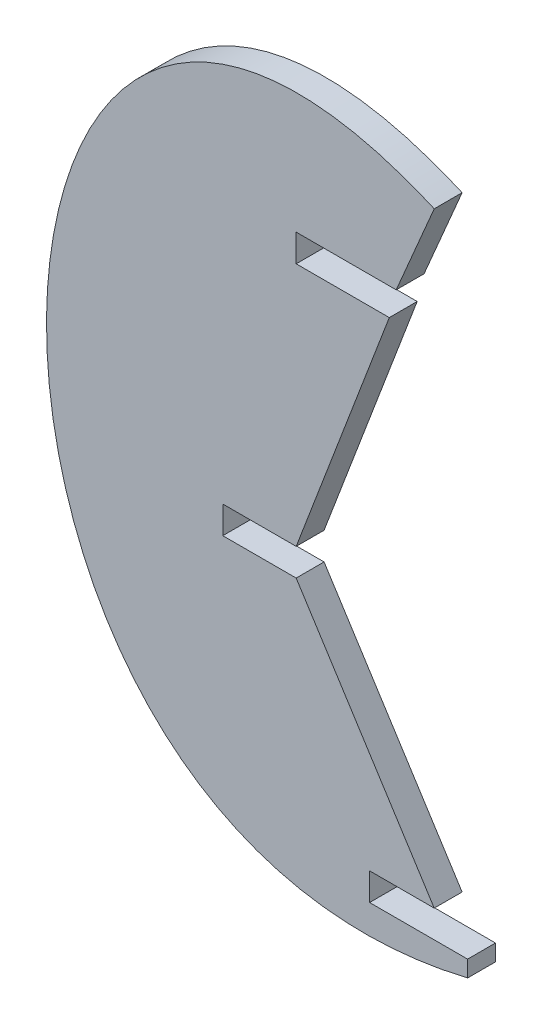
ISO-10303-21;
HEADER;
FILE_DESCRIPTION(('STEP AP214'),'2;1');
FILE_NAME('part.step','',(''),(''),'','','');
FILE_SCHEMA(('AUTOMOTIVE_DESIGN { 1 0 10303 214 1 1 1 1 }'));
ENDSEC;
DATA;
#1=APPLICATION_CONTEXT('core data for automotive mechanical design processes');
#2=APPLICATION_PROTOCOL_DEFINITION('international standard','automotive_design',2000,#1);
#3=PRODUCT_CONTEXT('',#1,'mechanical');
#4=PRODUCT('Part','Part','',(#3));
#5=PRODUCT_RELATED_PRODUCT_CATEGORY('part','',(#4));
#6=PRODUCT_DEFINITION_FORMATION('','',#4);
#7=PRODUCT_DEFINITION_CONTEXT('part definition',#1,'design');
#8=PRODUCT_DEFINITION('design','',#6,#7);
#9=PRODUCT_DEFINITION_SHAPE('','',#8);
#10=(LENGTH_UNIT() NAMED_UNIT(*) SI_UNIT(.MILLI.,.METRE.));
#11=(NAMED_UNIT(*) PLANE_ANGLE_UNIT() SI_UNIT($,.RADIAN.));
#12=(NAMED_UNIT(*) SI_UNIT($,.STERADIAN.) SOLID_ANGLE_UNIT());
#13=UNCERTAINTY_MEASURE_WITH_UNIT(LENGTH_MEASURE(1.E-05),#10,'distance_accuracy_value','');
#14=(GEOMETRIC_REPRESENTATION_CONTEXT(3) GLOBAL_UNCERTAINTY_ASSIGNED_CONTEXT((#13)) GLOBAL_UNIT_ASSIGNED_CONTEXT((#10,
#11,#12)) REPRESENTATION_CONTEXT('',''));
#15=CARTESIAN_POINT('',(0.,0.,0.));
#16=DIRECTION('',(0.,0.,1.));
#17=DIRECTION('',(1.,0.,0.));
#18=AXIS2_PLACEMENT_3D('',#15,#16,#17);
#19=CARTESIAN_POINT('',(-40.0225,105.61,5.7));
#20=DIRECTION('',(0.,1.,0.));
#21=DIRECTION('',(-1.,0.,0.));
#22=AXIS2_PLACEMENT_3D('',#19,#20,#21);
#23=PLANE('',#22);
#24=DIRECTION('',(1.,0.,0.));
#25=VECTOR('',#24,1.);
#26=CARTESIAN_POINT('',(-40.0225,105.61,0.));
#27=LINE('',#26,#25);
#28=CARTESIAN_POINT('',(-40.0225,105.61,0.));
#29=VERTEX_POINT('',#28);
#30=CARTESIAN_POINT('',(-20.9989229059,105.61,0.));
#31=VERTEX_POINT('',#30);
#32=EDGE_CURVE('E235',#29,#31,#27,.T.);
#33=ORIENTED_EDGE('',*,*,#32,.F.);
#34=DIRECTION('',(0.,0.,-1.));
#35=VECTOR('',#34,1.);
#36=CARTESIAN_POINT('',(-40.0225,105.61,5.7));
#37=LINE('',#36,#35);
#38=CARTESIAN_POINT('',(-40.0225,105.61,5.7));
#39=VERTEX_POINT('',#38);
#40=EDGE_CURVE('E12',#39,#29,#37,.T.);
#41=ORIENTED_EDGE('',*,*,#40,.F.);
#42=DIRECTION('',(1.,0.,0.));
#43=VECTOR('',#42,1.);
#44=CARTESIAN_POINT('',(-40.0225,105.61,5.7));
#45=LINE('',#44,#43);
#46=CARTESIAN_POINT('',(-20.9989229059,105.61,5.7));
#47=VERTEX_POINT('',#46);
#48=EDGE_CURVE('E227',#39,#47,#45,.T.);
#49=ORIENTED_EDGE('',*,*,#48,.T.);
#50=DIRECTION('',(0.,0.,-1.));
#51=VECTOR('',#50,1.);
#52=CARTESIAN_POINT('',(-20.9989229059,105.61,5.7));
#53=LINE('',#52,#51);
#54=EDGE_CURVE('E39',#47,#31,#53,.T.);
#55=ORIENTED_EDGE('',*,*,#54,.T.);
#56=EDGE_LOOP('',(#33,#41,#49,#55));
#57=FACE_BOUND('',#56,.T.);
#58=ADVANCED_FACE('F36',(#57),#23,.T.);
#59=CARTESIAN_POINT('',(-40.0225,111.22,5.7));
#60=DIRECTION('',(1.,0.,0.));
#61=DIRECTION('',(0.,0.,-1.));
#62=AXIS2_PLACEMENT_3D('',#59,#60,#61);
#63=PLANE('',#62);
#64=DIRECTION('',(0.,-1.,0.));
#65=VECTOR('',#64,1.);
#66=CARTESIAN_POINT('',(-40.0225,111.22,0.));
#67=LINE('',#66,#65);
#68=CARTESIAN_POINT('',(-40.0225,111.22,0.));
#69=VERTEX_POINT('',#68);
#70=EDGE_CURVE('E230',#69,#29,#67,.T.);
#71=ORIENTED_EDGE('',*,*,#70,.F.);
#72=DIRECTION('',(0.,0.,-1.));
#73=VECTOR('',#72,1.);
#74=CARTESIAN_POINT('',(-40.0225,111.22,5.7));
#75=LINE('',#74,#73);
#76=CARTESIAN_POINT('',(-40.0225,111.22,5.7));
#77=VERTEX_POINT('',#76);
#78=EDGE_CURVE('E45',#77,#69,#75,.T.);
#79=ORIENTED_EDGE('',*,*,#78,.F.);
#80=DIRECTION('',(0.,-1.,0.));
#81=VECTOR('',#80,1.);
#82=CARTESIAN_POINT('',(-40.0225,111.22,5.7));
#83=LINE('',#82,#81);
#84=EDGE_CURVE('E159',#77,#39,#83,.T.);
#85=ORIENTED_EDGE('',*,*,#84,.T.);
#86=ORIENTED_EDGE('',*,*,#40,.T.);
#87=EDGE_LOOP('',(#71,#79,#85,#86));
#88=FACE_BOUND('',#87,.T.);
#89=ADVANCED_FACE('F300',(#88),#63,.T.);
#90=CARTESIAN_POINT('',(-19.5846525168,111.22,5.7));
#91=DIRECTION('',(0.,-1.,0.));
#92=DIRECTION('',(0.,0.,-1.));
#93=AXIS2_PLACEMENT_3D('',#90,#91,#92);
#94=PLANE('',#93);
#95=DIRECTION('',(-1.,0.,0.));
#96=VECTOR('',#95,1.);
#97=CARTESIAN_POINT('',(-19.5846525168,111.22,0.));
#98=LINE('',#97,#96);
#99=CARTESIAN_POINT('',(-19.5846525168,111.22,0.));
#100=VERTEX_POINT('',#99);
#101=EDGE_CURVE('E146',#100,#69,#98,.T.);
#102=ORIENTED_EDGE('',*,*,#101,.F.);
#103=DIRECTION('',(0.,0.,-1.));
#104=VECTOR('',#103,1.);
#105=CARTESIAN_POINT('',(-19.5846525168,111.22,5.7));
#106=LINE('',#105,#104);
#107=CARTESIAN_POINT('',(-19.5846525168,111.22,5.7));
#108=VERTEX_POINT('',#107);
#109=EDGE_CURVE('E141',#108,#100,#106,.T.);
#110=ORIENTED_EDGE('',*,*,#109,.F.);
#111=DIRECTION('',(-1.,0.,0.));
#112=VECTOR('',#111,1.);
#113=CARTESIAN_POINT('',(-19.5846525168,111.22,5.7));
#114=LINE('',#113,#112);
#115=EDGE_CURVE('E144',#108,#77,#114,.T.);
#116=ORIENTED_EDGE('',*,*,#115,.T.);
#117=ORIENTED_EDGE('',*,*,#78,.T.);
#118=EDGE_LOOP('',(#102,#110,#116,#117));
#119=FACE_BOUND('',#118,.T.);
#120=ADVANCED_FACE('F143',(#119),#94,.T.);
#121=CARTESIAN_POINT('',(-11.8183247946,129.448781979,5.7));
#122=DIRECTION('',(0.919983637740173,-0.391956765843324,0.));
#123=DIRECTION('',(0.391956765843324,0.919983637740173,0.));
#124=AXIS2_PLACEMENT_3D('',#121,#122,#123);
#125=PLANE('',#124);
#126=DIRECTION('',(-0.391956765843324,-0.919983637740173,0.));
#127=VECTOR('',#126,1.);
#128=CARTESIAN_POINT('',(-11.8183247946,129.448781979,0.));
#129=LINE('',#128,#127);
#130=CARTESIAN_POINT('',(-11.8183247946,129.448781979,0.));
#131=VERTEX_POINT('',#130);
#132=EDGE_CURVE('E270',#131,#100,#129,.T.);
#133=ORIENTED_EDGE('',*,*,#132,.F.);
#134=DIRECTION('',(0.,0.,-1.));
#135=VECTOR('',#134,1.);
#136=CARTESIAN_POINT('',(-11.8183247946,129.448781979,5.7));
#137=LINE('',#136,#135);
#138=CARTESIAN_POINT('',(-11.8183247946,129.448781979,5.7));
#139=VERTEX_POINT('',#138);
#140=EDGE_CURVE('E151',#139,#131,#137,.T.);
#141=ORIENTED_EDGE('',*,*,#140,.F.);
#142=DIRECTION('',(-0.391956765843324,-0.919983637740173,0.));
#143=VECTOR('',#142,1.);
#144=CARTESIAN_POINT('',(-11.8183247946,129.448781979,5.7));
#145=LINE('',#144,#143);
#146=EDGE_CURVE('E157',#139,#108,#145,.T.);
#147=ORIENTED_EDGE('',*,*,#146,.T.);
#148=ORIENTED_EDGE('',*,*,#109,.T.);
#149=EDGE_LOOP('',(#133,#141,#147,#148));
#150=FACE_BOUND('',#149,.T.);
#151=ADVANCED_FACE('F162',(#150),#125,.T.);
#152=CARTESIAN_POINT('',(-5.00000000000001,-3.25412214329999,5.7));
#153=CARTESIAN_POINT('',(-122.039878303891,-31.2645838121814,5.7));
#154=CARTESIAN_POINT('',(-115.13067117282,174.542277049092,5.7));
#155=CARTESIAN_POINT('',(-11.8183247946,129.448781979,5.7));
#156=B_SPLINE_CURVE_WITH_KNOTS('',3,(#152,#153,#154,#155),.UNSPECIFIED.,.F.,.F.,(4,4),(0.,1.),.UNSPECIFIED.);
#157=DIRECTION('',(0.,0.,-1.));
#158=VECTOR('',#157,1.);
#159=SURFACE_OF_LINEAR_EXTRUSION('',#156,#158);
#160=CARTESIAN_POINT('',(-5.00000000000001,-3.25412214329999,0.));
#161=CARTESIAN_POINT('',(-122.039878303891,-31.2645838121814,0.));
#162=CARTESIAN_POINT('',(-115.13067117282,174.542277049092,0.));
#163=CARTESIAN_POINT('',(-11.8183247946,129.448781979,0.));
#164=B_SPLINE_CURVE_WITH_KNOTS('',3,(#160,#161,#162,#163),.UNSPECIFIED.,.F.,.F.,(4,4),(0.,1.),.UNSPECIFIED.);
#165=CARTESIAN_POINT('',(-5.00000000000005,-3.25412214329999,0.));
#166=VERTEX_POINT('',#165);
#167=EDGE_CURVE('E265',#166,#131,#164,.T.);
#168=ORIENTED_EDGE('',*,*,#167,.F.);
#169=DIRECTION('',(0.,0.,-1.));
#170=VECTOR('',#169,1.);
#171=CARTESIAN_POINT('',(-5.00000000000005,-3.25412214329999,5.7));
#172=LINE('',#171,#170);
#173=CARTESIAN_POINT('',(-5.00000000000005,-3.25412214329999,5.7));
#174=VERTEX_POINT('',#173);
#175=EDGE_CURVE('E280',#174,#166,#172,.T.);
#176=ORIENTED_EDGE('',*,*,#175,.F.);
#177=EDGE_CURVE('E164',#174,#139,#156,.T.);
#178=ORIENTED_EDGE('',*,*,#177,.T.);
#179=ORIENTED_EDGE('',*,*,#140,.T.);
#180=EDGE_LOOP('',(#168,#176,#178,#179));
#181=FACE_BOUND('',#180,.T.);
#182=ADVANCED_FACE('F313',(#181),#159,.T.);
#183=CARTESIAN_POINT('',(-5.00000000000003,0.0899999999999819,5.7));
#184=DIRECTION('',(1.,0.,0.));
#185=DIRECTION('',(0.,1.,0.));
#186=AXIS2_PLACEMENT_3D('',#183,#184,#185);
#187=PLANE('',#186);
#188=DIRECTION('',(0.,-1.,0.));
#189=VECTOR('',#188,1.);
#190=CARTESIAN_POINT('',(-5.00000000000003,0.0899999999999819,0.));
#191=LINE('',#190,#189);
#192=CARTESIAN_POINT('',(-5.00000000000003,0.0899999999999819,0.));
#193=VERTEX_POINT('',#192);
#194=EDGE_CURVE('E262',#193,#166,#191,.T.);
#195=ORIENTED_EDGE('',*,*,#194,.F.);
#196=DIRECTION('',(0.,0.,-1.));
#197=VECTOR('',#196,1.);
#198=CARTESIAN_POINT('',(-5.00000000000003,0.0899999999999819,5.7));
#199=LINE('',#198,#197);
#200=CARTESIAN_POINT('',(-5.00000000000003,0.0899999999999819,5.7));
#201=VERTEX_POINT('',#200);
#202=EDGE_CURVE('E282',#201,#193,#199,.T.);
#203=ORIENTED_EDGE('',*,*,#202,.F.);
#204=DIRECTION('',(0.,-1.,0.));
#205=VECTOR('',#204,1.);
#206=CARTESIAN_POINT('',(-5.00000000000003,0.0899999999999819,5.7));
#207=LINE('',#206,#205);
#208=EDGE_CURVE('E167',#201,#174,#207,.T.);
#209=ORIENTED_EDGE('',*,*,#208,.T.);
#210=ORIENTED_EDGE('',*,*,#175,.T.);
#211=EDGE_LOOP('',(#195,#203,#209,#210));
#212=FACE_BOUND('',#211,.T.);
#213=ADVANCED_FACE('F316',(#212),#187,.T.);
#214=CARTESIAN_POINT('',(-25.0225000000001,0.0900000000000293,5.7));
#215=DIRECTION('',(0.,1.,0.));
#216=DIRECTION('',(-1.,0.,0.));
#217=AXIS2_PLACEMENT_3D('',#214,#215,#216);
#218=PLANE('',#217);
#219=DIRECTION('',(1.,0.,0.));
#220=VECTOR('',#219,1.);
#221=CARTESIAN_POINT('',(-25.0225000000001,0.0900000000000293,0.));
#222=LINE('',#221,#220);
#223=CARTESIAN_POINT('',(-25.0225000000001,0.0900000000000293,0.));
#224=VERTEX_POINT('',#223);
#225=EDGE_CURVE('E259',#224,#193,#222,.T.);
#226=ORIENTED_EDGE('',*,*,#225,.F.);
#227=DIRECTION('',(0.,0.,-1.));
#228=VECTOR('',#227,1.);
#229=CARTESIAN_POINT('',(-25.0225000000001,0.0900000000000293,5.7));
#230=LINE('',#229,#228);
#231=CARTESIAN_POINT('',(-25.0225000000001,0.0900000000000293,5.7));
#232=VERTEX_POINT('',#231);
#233=EDGE_CURVE('E284',#232,#224,#230,.T.);
#234=ORIENTED_EDGE('',*,*,#233,.F.);
#235=DIRECTION('',(1.,0.,0.));
#236=VECTOR('',#235,1.);
#237=CARTESIAN_POINT('',(-25.0225000000001,0.0900000000000293,5.7));
#238=LINE('',#237,#236);
#239=EDGE_CURVE('E187',#232,#201,#238,.T.);
#240=ORIENTED_EDGE('',*,*,#239,.T.);
#241=ORIENTED_EDGE('',*,*,#202,.T.);
#242=EDGE_LOOP('',(#226,#234,#240,#241));
#243=FACE_BOUND('',#242,.T.);
#244=ADVANCED_FACE('F320',(#243),#218,.T.);
#245=CARTESIAN_POINT('',(-25.0225,5.70000000000003,5.7));
#246=DIRECTION('',(1.,0.,0.));
#247=DIRECTION('',(0.,1.,0.));
#248=AXIS2_PLACEMENT_3D('',#245,#246,#247);
#249=PLANE('',#248);
#250=DIRECTION('',(0.,-1.,0.));
#251=VECTOR('',#250,1.);
#252=CARTESIAN_POINT('',(-25.0225,5.70000000000003,0.));
#253=LINE('',#252,#251);
#254=CARTESIAN_POINT('',(-25.0225,5.70000000000003,0.));
#255=VERTEX_POINT('',#254);
#256=EDGE_CURVE('E256',#255,#224,#253,.T.);
#257=ORIENTED_EDGE('',*,*,#256,.F.);
#258=DIRECTION('',(0.,0.,-1.));
#259=VECTOR('',#258,1.);
#260=CARTESIAN_POINT('',(-25.0225,5.70000000000003,5.7));
#261=LINE('',#260,#259);
#262=CARTESIAN_POINT('',(-25.0225,5.70000000000003,5.7));
#263=VERTEX_POINT('',#262);
#264=EDGE_CURVE('E286',#263,#255,#261,.T.);
#265=ORIENTED_EDGE('',*,*,#264,.F.);
#266=DIRECTION('',(0.,-1.,0.));
#267=VECTOR('',#266,1.);
#268=CARTESIAN_POINT('',(-25.0225,5.70000000000003,5.7));
#269=LINE('',#268,#267);
#270=EDGE_CURVE('E192',#263,#232,#269,.T.);
#271=ORIENTED_EDGE('',*,*,#270,.T.);
#272=ORIENTED_EDGE('',*,*,#233,.T.);
#273=EDGE_LOOP('',(#257,#265,#271,#272));
#274=FACE_BOUND('',#273,.T.);
#275=ADVANCED_FACE('F324',(#274),#249,.T.);
#276=CARTESIAN_POINT('',(-11.8183247946,5.7,5.7));
#277=DIRECTION('',(0.,-1.,0.));
#278=DIRECTION('',(1.,0.,0.));
#279=AXIS2_PLACEMENT_3D('',#276,#277,#278);
#280=PLANE('',#279);
#281=DIRECTION('',(-1.,0.,0.));
#282=VECTOR('',#281,1.);
#283=CARTESIAN_POINT('',(-11.8183247946,5.7,0.));
#284=LINE('',#283,#282);
#285=CARTESIAN_POINT('',(-11.8183247946,5.7,0.));
#286=VERTEX_POINT('',#285);
#287=EDGE_CURVE('E253',#286,#255,#284,.T.);
#288=ORIENTED_EDGE('',*,*,#287,.F.);
#289=DIRECTION('',(0.,0.,-1.));
#290=VECTOR('',#289,1.);
#291=CARTESIAN_POINT('',(-11.8183247946,5.7,5.7));
#292=LINE('',#291,#290);
#293=CARTESIAN_POINT('',(-11.8183247946,5.7,5.7));
#294=VERTEX_POINT('',#293);
#295=EDGE_CURVE('E288',#294,#286,#292,.T.);
#296=ORIENTED_EDGE('',*,*,#295,.F.);
#297=DIRECTION('',(-1.,0.,0.));
#298=VECTOR('',#297,1.);
#299=CARTESIAN_POINT('',(-11.8183247946,5.7,5.7));
#300=LINE('',#299,#298);
#301=EDGE_CURVE('E197',#294,#263,#300,.T.);
#302=ORIENTED_EDGE('',*,*,#301,.T.);
#303=ORIENTED_EDGE('',*,*,#264,.T.);
#304=EDGE_LOOP('',(#288,#296,#302,#303));
#305=FACE_BOUND('',#304,.T.);
#306=ADVANCED_FACE('F328',(#305),#280,.T.);
#307=CARTESIAN_POINT('',(-40.0225,50.0085592292,5.7));
#308=DIRECTION('',(0.843594050426861,0.536981450409978,0.));
#309=DIRECTION('',(-0.536981450409978,0.843594050426861,0.));
#310=AXIS2_PLACEMENT_3D('',#307,#308,#309);
#311=PLANE('',#310);
#312=DIRECTION('',(0.536981450409978,-0.843594050426861,0.));
#313=VECTOR('',#312,1.);
#314=CARTESIAN_POINT('',(-40.0225,50.0085592292,0.));
#315=LINE('',#314,#313);
#316=CARTESIAN_POINT('',(-40.0225,50.0085592292,0.));
#317=VERTEX_POINT('',#316);
#318=EDGE_CURVE('E250',#317,#286,#315,.T.);
#319=ORIENTED_EDGE('',*,*,#318,.F.);
#320=DIRECTION('',(0.,0.,-1.));
#321=VECTOR('',#320,1.);
#322=CARTESIAN_POINT('',(-40.0225,50.0085592292,5.7));
#323=LINE('',#322,#321);
#324=CARTESIAN_POINT('',(-40.0225,50.0085592292,5.7));
#325=VERTEX_POINT('',#324);
#326=EDGE_CURVE('E290',#325,#317,#323,.T.);
#327=ORIENTED_EDGE('',*,*,#326,.F.);
#328=DIRECTION('',(0.536981450409978,-0.843594050426861,0.));
#329=VECTOR('',#328,1.);
#330=CARTESIAN_POINT('',(-40.0225,50.0085592292,5.7));
#331=LINE('',#330,#329);
#332=EDGE_CURVE('E205',#325,#294,#331,.T.);
#333=ORIENTED_EDGE('',*,*,#332,.T.);
#334=ORIENTED_EDGE('',*,*,#295,.T.);
#335=EDGE_LOOP('',(#319,#327,#333,#334));
#336=FACE_BOUND('',#335,.T.);
#337=ADVANCED_FACE('F332',(#336),#311,.T.);
#338=CARTESIAN_POINT('',(-55.0225,50.,5.7));
#339=DIRECTION('',(-0.000570615187103639,0.999999837199141,0.));
#340=DIRECTION('',(-0.999999837199141,-0.00057061518710364,0.));
#341=AXIS2_PLACEMENT_3D('',#338,#339,#340);
#342=PLANE('',#341);
#343=DIRECTION('',(0.999999837199141,0.00057061518710364,0.));
#344=VECTOR('',#343,1.);
#345=CARTESIAN_POINT('',(-55.0225,50.,0.));
#346=LINE('',#345,#344);
#347=CARTESIAN_POINT('',(-55.0225,50.,0.));
#348=VERTEX_POINT('',#347);
#349=EDGE_CURVE('E247',#348,#317,#346,.T.);
#350=ORIENTED_EDGE('',*,*,#349,.F.);
#351=DIRECTION('',(0.,0.,-1.));
#352=VECTOR('',#351,1.);
#353=CARTESIAN_POINT('',(-55.0225,50.,5.7));
#354=LINE('',#353,#352);
#355=CARTESIAN_POINT('',(-55.0225,50.,5.7));
#356=VERTEX_POINT('',#355);
#357=EDGE_CURVE('E292',#356,#348,#354,.T.);
#358=ORIENTED_EDGE('',*,*,#357,.F.);
#359=DIRECTION('',(0.999999837199141,0.00057061518710364,0.));
#360=VECTOR('',#359,1.);
#361=CARTESIAN_POINT('',(-55.0225,50.,5.7));
#362=LINE('',#361,#360);
#363=EDGE_CURVE('E209',#356,#325,#362,.T.);
#364=ORIENTED_EDGE('',*,*,#363,.T.);
#365=ORIENTED_EDGE('',*,*,#326,.T.);
#366=EDGE_LOOP('',(#350,#358,#364,#365));
#367=FACE_BOUND('',#366,.T.);
#368=ADVANCED_FACE('F336',(#367),#342,.T.);
#369=CARTESIAN_POINT('',(-55.0225,55.61,5.7));
#370=DIRECTION('',(1.,0.,0.));
#371=DIRECTION('',(0.,0.,-1.));
#372=AXIS2_PLACEMENT_3D('',#369,#370,#371);
#373=PLANE('',#372);
#374=DIRECTION('',(0.,-1.,0.));
#375=VECTOR('',#374,1.);
#376=CARTESIAN_POINT('',(-55.0225,55.61,0.));
#377=LINE('',#376,#375);
#378=CARTESIAN_POINT('',(-55.0225,55.61,0.));
#379=VERTEX_POINT('',#378);
#380=EDGE_CURVE('E244',#379,#348,#377,.T.);
#381=ORIENTED_EDGE('',*,*,#380,.F.);
#382=DIRECTION('',(0.,0.,-1.));
#383=VECTOR('',#382,1.);
#384=CARTESIAN_POINT('',(-55.0225,55.61,5.7));
#385=LINE('',#384,#383);
#386=CARTESIAN_POINT('',(-55.0225,55.61,5.7));
#387=VERTEX_POINT('',#386);
#388=EDGE_CURVE('E294',#387,#379,#385,.T.);
#389=ORIENTED_EDGE('',*,*,#388,.F.);
#390=DIRECTION('',(0.,-1.,0.));
#391=VECTOR('',#390,1.);
#392=CARTESIAN_POINT('',(-55.0225,55.61,5.7));
#393=LINE('',#392,#391);
#394=EDGE_CURVE('E214',#387,#356,#393,.T.);
#395=ORIENTED_EDGE('',*,*,#394,.T.);
#396=ORIENTED_EDGE('',*,*,#357,.T.);
#397=EDGE_LOOP('',(#381,#389,#395,#396));
#398=FACE_BOUND('',#397,.T.);
#399=ADVANCED_FACE('F340',(#398),#373,.T.);
#400=CARTESIAN_POINT('',(-40.0225,55.61,5.7));
#401=DIRECTION('',(0.,-1.,0.));
#402=DIRECTION('',(0.,0.,-1.));
#403=AXIS2_PLACEMENT_3D('',#400,#401,#402);
#404=PLANE('',#403);
#405=DIRECTION('',(-1.,0.,0.));
#406=VECTOR('',#405,1.);
#407=CARTESIAN_POINT('',(-40.0225,55.61,0.));
#408=LINE('',#407,#406);
#409=CARTESIAN_POINT('',(-40.0225,55.61,0.));
#410=VERTEX_POINT('',#409);
#411=EDGE_CURVE('E241',#410,#379,#408,.T.);
#412=ORIENTED_EDGE('',*,*,#411,.F.);
#413=DIRECTION('',(0.,0.,-1.));
#414=VECTOR('',#413,1.);
#415=CARTESIAN_POINT('',(-40.0225,55.61,5.7));
#416=LINE('',#415,#414);
#417=CARTESIAN_POINT('',(-40.0225,55.61,5.7));
#418=VERTEX_POINT('',#417);
#419=EDGE_CURVE('E295',#418,#410,#416,.T.);
#420=ORIENTED_EDGE('',*,*,#419,.F.);
#421=DIRECTION('',(-1.,0.,0.));
#422=VECTOR('',#421,1.);
#423=CARTESIAN_POINT('',(-40.0225,55.61,5.7));
#424=LINE('',#423,#422);
#425=EDGE_CURVE('E219',#418,#387,#424,.T.);
#426=ORIENTED_EDGE('',*,*,#425,.T.);
#427=ORIENTED_EDGE('',*,*,#388,.T.);
#428=EDGE_LOOP('',(#412,#420,#426,#427));
#429=FACE_BOUND('',#428,.T.);
#430=ADVANCED_FACE('F344',(#429),#404,.T.);
#431=CARTESIAN_POINT('',(-20.9989229059,105.61,5.7));
#432=DIRECTION('',(0.934637159233588,-0.355602841073815,0.));
#433=DIRECTION('',(0.355602841073815,0.934637159233588,0.));
#434=AXIS2_PLACEMENT_3D('',#431,#432,#433);
#435=PLANE('',#434);
#436=DIRECTION('',(-0.355602841073815,-0.934637159233588,0.));
#437=VECTOR('',#436,1.);
#438=CARTESIAN_POINT('',(-20.9989229059,105.61,0.));
#439=LINE('',#438,#437);
#440=EDGE_CURVE('E238',#31,#410,#439,.T.);
#441=ORIENTED_EDGE('',*,*,#440,.F.);
#442=ORIENTED_EDGE('',*,*,#54,.F.);
#443=DIRECTION('',(-0.355602841073815,-0.934637159233588,0.));
#444=VECTOR('',#443,1.);
#445=CARTESIAN_POINT('',(-20.9989229059,105.61,5.7));
#446=LINE('',#445,#444);
#447=EDGE_CURVE('E223',#47,#418,#446,.T.);
#448=ORIENTED_EDGE('',*,*,#447,.T.);
#449=ORIENTED_EDGE('',*,*,#419,.T.);
#450=EDGE_LOOP('',(#441,#442,#448,#449));
#451=FACE_BOUND('',#450,.T.);
#452=ADVANCED_FACE('F297',(#451),#435,.T.);
#453=CARTESIAN_POINT('',(-91.0412466530916,69.5034674433041,5.7));
#454=DIRECTION('',(0.,0.,1.));
#455=DIRECTION('',(1.,0.,0.));
#456=AXIS2_PLACEMENT_3D('',#453,#454,#455);
#457=PLANE('',#456);
#458=ORIENTED_EDGE('',*,*,#48,.F.);
#459=ORIENTED_EDGE('',*,*,#84,.F.);
#460=ORIENTED_EDGE('',*,*,#115,.F.);
#461=ORIENTED_EDGE('',*,*,#146,.F.);
#462=ORIENTED_EDGE('',*,*,#177,.F.);
#463=ORIENTED_EDGE('',*,*,#208,.F.);
#464=ORIENTED_EDGE('',*,*,#239,.F.);
#465=ORIENTED_EDGE('',*,*,#270,.F.);
#466=ORIENTED_EDGE('',*,*,#301,.F.);
#467=ORIENTED_EDGE('',*,*,#332,.F.);
#468=ORIENTED_EDGE('',*,*,#363,.F.);
#469=ORIENTED_EDGE('',*,*,#394,.F.);
#470=ORIENTED_EDGE('',*,*,#425,.F.);
#471=ORIENTED_EDGE('',*,*,#447,.F.);
#472=EDGE_LOOP('',(#458,#459,#460,#461,#462,#463,#464,#465,#466,#467,#468,#469,#470,#471));
#473=FACE_BOUND('',#472,.T.);
#474=ADVANCED_FACE('F155',(#473),#457,.T.);
#475=CARTESIAN_POINT('',(-91.0412466530916,69.5034674433041,0.));
#476=DIRECTION('',(0.,0.,1.));
#477=DIRECTION('',(1.,0.,0.));
#478=AXIS2_PLACEMENT_3D('',#475,#476,#477);
#479=PLANE('',#478);
#480=ORIENTED_EDGE('',*,*,#32,.T.);
#481=ORIENTED_EDGE('',*,*,#440,.T.);
#482=ORIENTED_EDGE('',*,*,#411,.T.);
#483=ORIENTED_EDGE('',*,*,#380,.T.);
#484=ORIENTED_EDGE('',*,*,#349,.T.);
#485=ORIENTED_EDGE('',*,*,#318,.T.);
#486=ORIENTED_EDGE('',*,*,#287,.T.);
#487=ORIENTED_EDGE('',*,*,#256,.T.);
#488=ORIENTED_EDGE('',*,*,#225,.T.);
#489=ORIENTED_EDGE('',*,*,#194,.T.);
#490=ORIENTED_EDGE('',*,*,#167,.T.);
#491=ORIENTED_EDGE('',*,*,#132,.T.);
#492=ORIENTED_EDGE('',*,*,#101,.T.);
#493=ORIENTED_EDGE('',*,*,#70,.T.);
#494=EDGE_LOOP('',(#480,#481,#482,#483,#484,#485,#486,#487,#488,#489,#490,#491,#492,#493));
#495=FACE_BOUND('',#494,.T.);
#496=ADVANCED_FACE('F299',(#495),#479,.F.);
#497=CLOSED_SHELL('',(#58,#89,#120,#151,#182,#213,#244,#275,#306,#337,#368,#399,#430,#452,#474,#496));
#498=MANIFOLD_SOLID_BREP('B2',#497);
#499=ADVANCED_BREP_SHAPE_REPRESENTATION('',(#18,#498),#14);
#500=SHAPE_DEFINITION_REPRESENTATION(#9,#499);
ENDSEC;
END-ISO-10303-21;
